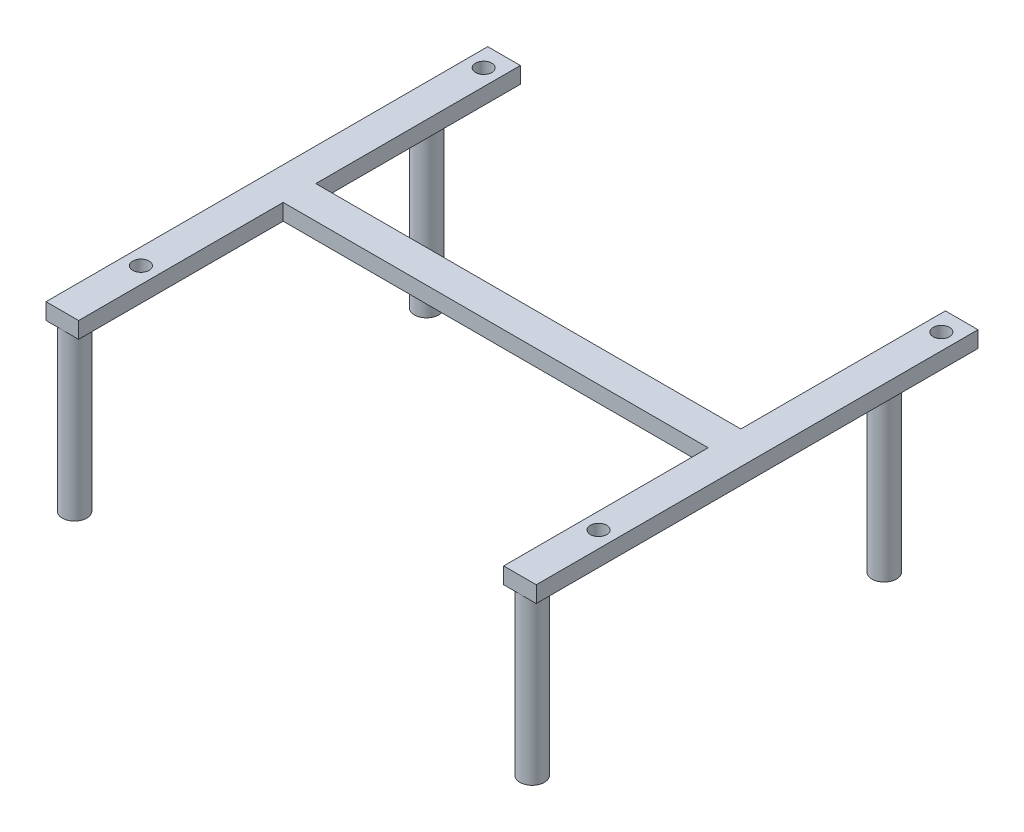
ISO-10303-21;
HEADER;
FILE_DESCRIPTION(('STEP AP214'),'2;1');
FILE_NAME('part.step','',(''),(''),'','','');
FILE_SCHEMA(('AUTOMOTIVE_DESIGN { 1 0 10303 214 1 1 1 1 }'));
ENDSEC;
DATA;
#1=APPLICATION_CONTEXT('core data for automotive mechanical design processes');
#2=APPLICATION_PROTOCOL_DEFINITION('international standard','automotive_design',2000,#1);
#3=PRODUCT_CONTEXT('',#1,'mechanical');
#4=PRODUCT('Part','Part','',(#3));
#5=PRODUCT_RELATED_PRODUCT_CATEGORY('part','',(#4));
#6=PRODUCT_DEFINITION_FORMATION('','',#4);
#7=PRODUCT_DEFINITION_CONTEXT('part definition',#1,'design');
#8=PRODUCT_DEFINITION('design','',#6,#7);
#9=PRODUCT_DEFINITION_SHAPE('','',#8);
#10=(LENGTH_UNIT() NAMED_UNIT(*) SI_UNIT(.MILLI.,.METRE.));
#11=(NAMED_UNIT(*) PLANE_ANGLE_UNIT() SI_UNIT($,.RADIAN.));
#12=(NAMED_UNIT(*) SI_UNIT($,.STERADIAN.) SOLID_ANGLE_UNIT());
#13=UNCERTAINTY_MEASURE_WITH_UNIT(LENGTH_MEASURE(1.E-05),#10,'distance_accuracy_value','');
#14=(GEOMETRIC_REPRESENTATION_CONTEXT(3) GLOBAL_UNCERTAINTY_ASSIGNED_CONTEXT((#13)) GLOBAL_UNIT_ASSIGNED_CONTEXT((#10,
#11,#12)) REPRESENTATION_CONTEXT('',''));
#15=CARTESIAN_POINT('',(0.,0.,0.));
#16=DIRECTION('',(0.,0.,1.));
#17=DIRECTION('',(1.,0.,0.));
#18=AXIS2_PLACEMENT_3D('',#15,#16,#17);
#19=CARTESIAN_POINT('',(56.13,20.,0.));
#20=DIRECTION('',(0.,-1.,0.));
#21=DIRECTION('',(0.,0.,-1.));
#22=AXIS2_PLACEMENT_3D('',#19,#20,#21);
#23=CYLINDRICAL_SURFACE('',#22,1.5);
#24=CARTESIAN_POINT('',(56.13,20.,0.));
#25=DIRECTION('',(0.,1.,0.));
#26=DIRECTION('',(0.,0.,1.));
#27=AXIS2_PLACEMENT_3D('',#24,#25,#26);
#28=CIRCLE('',#27,1.5);
#29=CARTESIAN_POINT('',(56.13,20.,1.49999999999999));
#30=VERTEX_POINT('',#29);
#31=EDGE_CURVE('E56',#30,#30,#28,.T.);
#32=ORIENTED_EDGE('',*,*,#31,.F.);
#33=EDGE_LOOP('',(#32));
#34=FACE_BOUND('',#33,.T.);
#35=CARTESIAN_POINT('',(56.13,0.,0.));
#36=DIRECTION('',(0.,1.,0.));
#37=DIRECTION('',(0.,0.,1.));
#38=AXIS2_PLACEMENT_3D('',#35,#36,#37);
#39=CIRCLE('',#38,1.5);
#40=CARTESIAN_POINT('',(56.13,0.,1.49999999999999));
#41=VERTEX_POINT('',#40);
#42=EDGE_CURVE('E11',#41,#41,#39,.T.);
#43=ORIENTED_EDGE('',*,*,#42,.T.);
#44=EDGE_LOOP('',(#43));
#45=FACE_BOUND('',#44,.T.);
#46=ADVANCED_FACE('F52',(#34,#45),#23,.T.);
#47=CARTESIAN_POINT('',(56.13,20.,0.));
#48=DIRECTION('',(0.,1.,0.));
#49=DIRECTION('',(0.,0.,1.));
#50=AXIS2_PLACEMENT_3D('',#47,#48,#49);
#51=PLANE('',#50);
#52=ORIENTED_EDGE('',*,*,#31,.T.);
#53=EDGE_LOOP('',(#52));
#54=FACE_BOUND('',#53,.T.);
#55=ADVANCED_FACE('F54',(#54),#51,.T.);
#56=CARTESIAN_POINT('',(56.13,0.,0.));
#57=DIRECTION('',(0.,1.,0.));
#58=DIRECTION('',(0.,0.,1.));
#59=AXIS2_PLACEMENT_3D('',#56,#57,#58);
#60=PLANE('',#59);
#61=ORIENTED_EDGE('',*,*,#42,.F.);
#62=EDGE_LOOP('',(#61));
#63=FACE_BOUND('',#62,.T.);
#64=ADVANCED_FACE('F71',(#63),#60,.F.);
#65=CLOSED_SHELL('',(#46,#55,#64));
#66=MANIFOLD_SOLID_BREP('B2',#65);
#67=CARTESIAN_POINT('',(56.13,20.,-43.18));
#68=DIRECTION('',(0.,-1.,0.));
#69=DIRECTION('',(0.,0.,-1.));
#70=AXIS2_PLACEMENT_3D('',#67,#68,#69);
#71=CYLINDRICAL_SURFACE('',#70,1.5);
#72=CARTESIAN_POINT('',(56.13,20.,-43.18));
#73=DIRECTION('',(0.,1.,0.));
#74=DIRECTION('',(0.,0.,1.));
#75=AXIS2_PLACEMENT_3D('',#72,#73,#74);
#76=CIRCLE('',#75,1.5);
#77=CARTESIAN_POINT('',(56.13,20.,-41.68));
#78=VERTEX_POINT('',#77);
#79=EDGE_CURVE('E106',#78,#78,#76,.T.);
#80=ORIENTED_EDGE('',*,*,#79,.F.);
#81=EDGE_LOOP('',(#80));
#82=FACE_BOUND('',#81,.T.);
#83=CARTESIAN_POINT('',(56.13,0.,-43.18));
#84=DIRECTION('',(0.,1.,0.));
#85=DIRECTION('',(0.,0.,1.));
#86=AXIS2_PLACEMENT_3D('',#83,#84,#85);
#87=CIRCLE('',#86,1.5);
#88=CARTESIAN_POINT('',(56.13,0.,-41.68));
#89=VERTEX_POINT('',#88);
#90=EDGE_CURVE('E51',#89,#89,#87,.T.);
#91=ORIENTED_EDGE('',*,*,#90,.T.);
#92=EDGE_LOOP('',(#91));
#93=FACE_BOUND('',#92,.T.);
#94=ADVANCED_FACE('F102',(#82,#93),#71,.T.);
#95=CARTESIAN_POINT('',(56.13,20.,-43.18));
#96=DIRECTION('',(0.,1.,0.));
#97=DIRECTION('',(0.,0.,1.));
#98=AXIS2_PLACEMENT_3D('',#95,#96,#97);
#99=PLANE('',#98);
#100=ORIENTED_EDGE('',*,*,#79,.T.);
#101=EDGE_LOOP('',(#100));
#102=FACE_BOUND('',#101,.T.);
#103=ADVANCED_FACE('F104',(#102),#99,.T.);
#104=CARTESIAN_POINT('',(56.13,0.,-43.18));
#105=DIRECTION('',(0.,1.,0.));
#106=DIRECTION('',(0.,0.,1.));
#107=AXIS2_PLACEMENT_3D('',#104,#105,#106);
#108=PLANE('',#107);
#109=ORIENTED_EDGE('',*,*,#90,.F.);
#110=EDGE_LOOP('',(#109));
#111=FACE_BOUND('',#110,.T.);
#112=ADVANCED_FACE('F121',(#111),#108,.F.);
#113=CLOSED_SHELL('',(#94,#103,#112));
#114=MANIFOLD_SOLID_BREP('B6',#113);
#115=CARTESIAN_POINT('',(0.,20.,0.));
#116=DIRECTION('',(0.,-1.,0.));
#117=DIRECTION('',(0.,0.,-1.));
#118=AXIS2_PLACEMENT_3D('',#115,#116,#117);
#119=CYLINDRICAL_SURFACE('',#118,1.5);
#120=CARTESIAN_POINT('',(0.,20.,0.));
#121=DIRECTION('',(0.,1.,0.));
#122=DIRECTION('',(0.,0.,1.));
#123=AXIS2_PLACEMENT_3D('',#120,#121,#122);
#124=CIRCLE('',#123,1.5);
#125=CARTESIAN_POINT('',(0.,20.,1.5));
#126=VERTEX_POINT('',#125);
#127=EDGE_CURVE('E151',#126,#126,#124,.T.);
#128=ORIENTED_EDGE('',*,*,#127,.F.);
#129=EDGE_LOOP('',(#128));
#130=FACE_BOUND('',#129,.T.);
#131=CARTESIAN_POINT('',(0.,0.,0.));
#132=DIRECTION('',(0.,1.,0.));
#133=DIRECTION('',(0.,0.,1.));
#134=AXIS2_PLACEMENT_3D('',#131,#132,#133);
#135=CIRCLE('',#134,1.5);
#136=CARTESIAN_POINT('',(0.,0.,1.5));
#137=VERTEX_POINT('',#136);
#138=EDGE_CURVE('E349',#137,#137,#135,.T.);
#139=ORIENTED_EDGE('',*,*,#138,.T.);
#140=EDGE_LOOP('',(#139));
#141=FACE_BOUND('',#140,.T.);
#142=ADVANCED_FACE('F143',(#130,#141),#119,.T.);
#143=CARTESIAN_POINT('',(0.,0.,0.));
#144=DIRECTION('',(0.,1.,0.));
#145=DIRECTION('',(0.,0.,1.));
#146=AXIS2_PLACEMENT_3D('',#143,#144,#145);
#147=PLANE('',#146);
#148=ORIENTED_EDGE('',*,*,#138,.F.);
#149=EDGE_LOOP('',(#148));
#150=FACE_BOUND('',#149,.T.);
#151=ADVANCED_FACE('F356',(#150),#147,.F.);
#152=CARTESIAN_POINT('',(0.,20.,0.));
#153=DIRECTION('',(0.,1.,0.));
#154=DIRECTION('',(0.,0.,1.));
#155=AXIS2_PLACEMENT_3D('',#152,#153,#154);
#156=PLANE('',#155);
#157=CARTESIAN_POINT('',(56.13,20.,-50.18));
#158=DIRECTION('',(0.,1.,0.));
#159=DIRECTION('',(0.,0.,1.));
#160=AXIS2_PLACEMENT_3D('',#157,#158,#159);
#161=CIRCLE('',#160,0.999999999999998);
#162=CARTESIAN_POINT('',(56.13,20.,-49.18));
#163=VERTEX_POINT('',#162);
#164=EDGE_CURVE('E459',#163,#163,#161,.F.);
#165=ORIENTED_EDGE('',*,*,#164,.F.);
#166=EDGE_LOOP('',(#165));
#167=FACE_BOUND('',#166,.T.);
#168=CARTESIAN_POINT('',(56.13,20.,-8.14300000000001));
#169=DIRECTION('',(0.,1.,0.));
#170=DIRECTION('',(0.,0.,1.));
#171=AXIS2_PLACEMENT_3D('',#168,#169,#170);
#172=CIRCLE('',#171,0.999999999999998);
#173=CARTESIAN_POINT('',(56.13,20.,-7.14300000000001));
#174=VERTEX_POINT('',#173);
#175=EDGE_CURVE('E452',#174,#174,#172,.F.);
#176=ORIENTED_EDGE('',*,*,#175,.F.);
#177=EDGE_LOOP('',(#176));
#178=FACE_BOUND('',#177,.T.);
#179=CARTESIAN_POINT('',(0.,20.,-8.143));
#180=DIRECTION('',(0.,1.,0.));
#181=DIRECTION('',(0.,0.,1.));
#182=AXIS2_PLACEMENT_3D('',#179,#180,#181);
#183=CIRCLE('',#182,1.);
#184=CARTESIAN_POINT('',(0.,20.,-7.143));
#185=VERTEX_POINT('',#184);
#186=EDGE_CURVE('E442',#185,#185,#183,.F.);
#187=ORIENTED_EDGE('',*,*,#186,.F.);
#188=EDGE_LOOP('',(#187));
#189=FACE_BOUND('',#188,.T.);
#190=CARTESIAN_POINT('',(0.,20.,-50.18));
#191=DIRECTION('',(0.,1.,0.));
#192=DIRECTION('',(0.,0.,1.));
#193=AXIS2_PLACEMENT_3D('',#190,#191,#192);
#194=CIRCLE('',#193,1.);
#195=CARTESIAN_POINT('',(0.,20.,-49.18));
#196=VERTEX_POINT('',#195);
#197=EDGE_CURVE('E469',#196,#196,#194,.F.);
#198=ORIENTED_EDGE('',*,*,#197,.F.);
#199=EDGE_LOOP('',(#198));
#200=FACE_BOUND('',#199,.T.);
#201=CARTESIAN_POINT('',(0.,20.,-43.18));
#202=DIRECTION('',(0.,1.,0.));
#203=DIRECTION('',(0.,0.,1.));
#204=AXIS2_PLACEMENT_3D('',#201,#202,#203);
#205=CIRCLE('',#204,1.5);
#206=CARTESIAN_POINT('',(0.,20.,-41.68));
#207=VERTEX_POINT('',#206);
#208=EDGE_CURVE('E100',#207,#207,#205,.F.);
#209=ORIENTED_EDGE('',*,*,#208,.F.);
#210=EDGE_LOOP('',(#209));
#211=FACE_BOUND('',#210,.T.);
#212=DIRECTION('',(1.,0.,0.));
#213=VECTOR('',#212,1.);
#214=CARTESIAN_POINT('',(-2.,20.,1.5));
#215=LINE('',#214,#213);
#216=CARTESIAN_POINT('',(2.,20.,1.5));
#217=VERTEX_POINT('',#216);
#218=EDGE_CURVE('E281',#126,#217,#215,.T.);
#219=ORIENTED_EDGE('',*,*,#218,.F.);
#220=ORIENTED_EDGE('',*,*,#127,.T.);
#221=CARTESIAN_POINT('',(-2.,20.,1.5));
#222=VERTEX_POINT('',#221);
#223=EDGE_CURVE('E282',#222,#126,#215,.T.);
#224=ORIENTED_EDGE('',*,*,#223,.F.);
#225=DIRECTION('',(0.,0.,1.));
#226=VECTOR('',#225,1.);
#227=CARTESIAN_POINT('',(-2.00000000000001,20.,-52.68));
#228=LINE('',#227,#226);
#229=CARTESIAN_POINT('',(-2.00000000000001,20.,-52.68));
#230=VERTEX_POINT('',#229);
#231=EDGE_CURVE('E277',#230,#222,#228,.T.);
#232=ORIENTED_EDGE('',*,*,#231,.F.);
#233=DIRECTION('',(-1.,0.,0.));
#234=VECTOR('',#233,1.);
#235=CARTESIAN_POINT('',(1.99999999999999,20.,-52.68));
#236=LINE('',#235,#234);
#237=CARTESIAN_POINT('',(1.99999999999999,20.,-52.68));
#238=VERTEX_POINT('',#237);
#239=EDGE_CURVE('E273',#238,#230,#236,.T.);
#240=ORIENTED_EDGE('',*,*,#239,.F.);
#241=DIRECTION('',(0.,0.,-1.));
#242=VECTOR('',#241,1.);
#243=CARTESIAN_POINT('',(1.99999999999999,20.,-52.68));
#244=LINE('',#243,#242);
#245=CARTESIAN_POINT('',(2.,20.,-27.59));
#246=VERTEX_POINT('',#245);
#247=EDGE_CURVE('E207',#246,#238,#244,.T.);
#248=ORIENTED_EDGE('',*,*,#247,.F.);
#249=DIRECTION('',(-1.,0.,0.));
#250=VECTOR('',#249,1.);
#251=CARTESIAN_POINT('',(2.,20.,-27.59));
#252=LINE('',#251,#250);
#253=CARTESIAN_POINT('',(54.13,20.,-27.59));
#254=VERTEX_POINT('',#253);
#255=EDGE_CURVE('E306',#254,#246,#252,.T.);
#256=ORIENTED_EDGE('',*,*,#255,.F.);
#257=DIRECTION('',(0.,0.,1.));
#258=VECTOR('',#257,1.);
#259=CARTESIAN_POINT('',(54.13,20.,-52.68));
#260=LINE('',#259,#258);
#261=CARTESIAN_POINT('',(54.13,20.,-52.68));
#262=VERTEX_POINT('',#261);
#263=EDGE_CURVE('E258',#262,#254,#260,.T.);
#264=ORIENTED_EDGE('',*,*,#263,.F.);
#265=DIRECTION('',(-1.,0.,0.));
#266=VECTOR('',#265,1.);
#267=CARTESIAN_POINT('',(58.13,20.,-52.68));
#268=LINE('',#267,#266);
#269=CARTESIAN_POINT('',(58.13,20.,-52.68));
#270=VERTEX_POINT('',#269);
#271=EDGE_CURVE('E301',#270,#262,#268,.T.);
#272=ORIENTED_EDGE('',*,*,#271,.F.);
#273=DIRECTION('',(0.,0.,-1.));
#274=VECTOR('',#273,1.);
#275=CARTESIAN_POINT('',(58.13,20.,1.49999999999999));
#276=LINE('',#275,#274);
#277=CARTESIAN_POINT('',(58.13,20.,1.49999999999999));
#278=VERTEX_POINT('',#277);
#279=EDGE_CURVE('E298',#278,#270,#276,.T.);
#280=ORIENTED_EDGE('',*,*,#279,.F.);
#281=DIRECTION('',(1.,0.,0.));
#282=VECTOR('',#281,1.);
#283=CARTESIAN_POINT('',(54.13,20.,1.49999999999999));
#284=LINE('',#283,#282);
#285=CARTESIAN_POINT('',(54.13,20.,1.49999999999999));
#286=VERTEX_POINT('',#285);
#287=EDGE_CURVE('E295',#286,#278,#284,.T.);
#288=ORIENTED_EDGE('',*,*,#287,.F.);
#289=DIRECTION('',(0.,0.,1.));
#290=VECTOR('',#289,1.);
#291=CARTESIAN_POINT('',(54.13,20.,-23.59));
#292=LINE('',#291,#290);
#293=CARTESIAN_POINT('',(54.13,20.,-23.59));
#294=VERTEX_POINT('',#293);
#295=EDGE_CURVE('E292',#294,#286,#292,.T.);
#296=ORIENTED_EDGE('',*,*,#295,.F.);
#297=DIRECTION('',(1.,0.,0.));
#298=VECTOR('',#297,1.);
#299=CARTESIAN_POINT('',(54.13,20.,-23.59));
#300=LINE('',#299,#298);
#301=CARTESIAN_POINT('',(2.,20.,-23.59));
#302=VERTEX_POINT('',#301);
#303=EDGE_CURVE('E289',#302,#294,#300,.T.);
#304=ORIENTED_EDGE('',*,*,#303,.F.);
#305=DIRECTION('',(0.,0.,-1.));
#306=VECTOR('',#305,1.);
#307=CARTESIAN_POINT('',(2.,20.,-23.59));
#308=LINE('',#307,#306);
#309=EDGE_CURVE('E286',#217,#302,#308,.T.);
#310=ORIENTED_EDGE('',*,*,#309,.F.);
#311=EDGE_LOOP('',(#219,#220,#224,#232,#240,#248,#256,#264,#272,#280,#288,#296,#304,#310));
#312=FACE_BOUND('',#311,.T.);
#313=ADVANCED_FACE('F358',(#167,#178,#189,#200,#211,#312),#156,.F.);
#314=CARTESIAN_POINT('',(1.99999999999999,22.,-52.68));
#315=DIRECTION('',(0.,0.,1.));
#316=DIRECTION('',(1.,0.,0.));
#317=AXIS2_PLACEMENT_3D('',#314,#315,#316);
#318=PLANE('',#317);
#319=ORIENTED_EDGE('',*,*,#239,.T.);
#320=DIRECTION('',(0.,-1.,0.));
#321=VECTOR('',#320,1.);
#322=CARTESIAN_POINT('',(-2.00000000000001,22.,-52.68));
#323=LINE('',#322,#321);
#324=CARTESIAN_POINT('',(-2.00000000000001,22.,-52.68));
#325=VERTEX_POINT('',#324);
#326=EDGE_CURVE('E346',#325,#230,#323,.T.);
#327=ORIENTED_EDGE('',*,*,#326,.F.);
#328=DIRECTION('',(-1.,0.,0.));
#329=VECTOR('',#328,1.);
#330=CARTESIAN_POINT('',(1.99999999999999,22.,-52.68));
#331=LINE('',#330,#329);
#332=CARTESIAN_POINT('',(1.99999999999999,22.,-52.68));
#333=VERTEX_POINT('',#332);
#334=EDGE_CURVE('E311',#333,#325,#331,.T.);
#335=ORIENTED_EDGE('',*,*,#334,.F.);
#336=DIRECTION('',(0.,-1.,0.));
#337=VECTOR('',#336,1.);
#338=CARTESIAN_POINT('',(1.99999999999999,22.,-52.68));
#339=LINE('',#338,#337);
#340=EDGE_CURVE('E269',#333,#238,#339,.T.);
#341=ORIENTED_EDGE('',*,*,#340,.T.);
#342=EDGE_LOOP('',(#319,#327,#335,#341));
#343=FACE_BOUND('',#342,.T.);
#344=ADVANCED_FACE('F363',(#343),#318,.F.);
#345=CARTESIAN_POINT('',(-2.00000000000001,22.,-52.68));
#346=DIRECTION('',(1.,0.,0.));
#347=DIRECTION('',(0.,0.,-1.));
#348=AXIS2_PLACEMENT_3D('',#345,#346,#347);
#349=PLANE('',#348);
#350=ORIENTED_EDGE('',*,*,#231,.T.);
#351=DIRECTION('',(0.,-1.,0.));
#352=VECTOR('',#351,1.);
#353=CARTESIAN_POINT('',(-2.,22.,1.5));
#354=LINE('',#353,#352);
#355=CARTESIAN_POINT('',(-2.,22.,1.5));
#356=VERTEX_POINT('',#355);
#357=EDGE_CURVE('E342',#356,#222,#354,.T.);
#358=ORIENTED_EDGE('',*,*,#357,.F.);
#359=DIRECTION('',(0.,0.,1.));
#360=VECTOR('',#359,1.);
#361=CARTESIAN_POINT('',(-2.00000000000001,22.,-52.68));
#362=LINE('',#361,#360);
#363=EDGE_CURVE('E216',#325,#356,#362,.T.);
#364=ORIENTED_EDGE('',*,*,#363,.F.);
#365=ORIENTED_EDGE('',*,*,#326,.T.);
#366=EDGE_LOOP('',(#350,#358,#364,#365));
#367=FACE_BOUND('',#366,.T.);
#368=ADVANCED_FACE('F369',(#367),#349,.F.);
#369=CARTESIAN_POINT('',(-2.,22.,1.5));
#370=DIRECTION('',(0.,0.,-1.));
#371=DIRECTION('',(-1.,0.,0.));
#372=AXIS2_PLACEMENT_3D('',#369,#370,#371);
#373=PLANE('',#372);
#374=ORIENTED_EDGE('',*,*,#223,.T.);
#375=ORIENTED_EDGE('',*,*,#218,.T.);
#376=DIRECTION('',(0.,-1.,0.));
#377=VECTOR('',#376,1.);
#378=CARTESIAN_POINT('',(2.,22.,1.5));
#379=LINE('',#378,#377);
#380=CARTESIAN_POINT('',(2.,22.,1.5));
#381=VERTEX_POINT('',#380);
#382=EDGE_CURVE('E338',#381,#217,#379,.T.);
#383=ORIENTED_EDGE('',*,*,#382,.F.);
#384=DIRECTION('',(1.,0.,0.));
#385=VECTOR('',#384,1.);
#386=CARTESIAN_POINT('',(-2.,22.,1.5));
#387=LINE('',#386,#385);
#388=EDGE_CURVE('E480',#356,#381,#387,.T.);
#389=ORIENTED_EDGE('',*,*,#388,.F.);
#390=ORIENTED_EDGE('',*,*,#357,.T.);
#391=EDGE_LOOP('',(#374,#375,#383,#389,#390));
#392=FACE_BOUND('',#391,.T.);
#393=ADVANCED_FACE('F373',(#392),#373,.F.);
#394=CARTESIAN_POINT('',(2.,22.,-23.59));
#395=DIRECTION('',(-1.,0.,0.));
#396=DIRECTION('',(0.,0.,1.));
#397=AXIS2_PLACEMENT_3D('',#394,#395,#396);
#398=PLANE('',#397);
#399=ORIENTED_EDGE('',*,*,#309,.T.);
#400=DIRECTION('',(0.,-1.,0.));
#401=VECTOR('',#400,1.);
#402=CARTESIAN_POINT('',(2.,22.,-23.59));
#403=LINE('',#402,#401);
#404=CARTESIAN_POINT('',(2.,22.,-23.59));
#405=VERTEX_POINT('',#404);
#406=EDGE_CURVE('E334',#405,#302,#403,.T.);
#407=ORIENTED_EDGE('',*,*,#406,.F.);
#408=DIRECTION('',(0.,0.,-1.));
#409=VECTOR('',#408,1.);
#410=CARTESIAN_POINT('',(2.,22.,-23.59));
#411=LINE('',#410,#409);
#412=EDGE_CURVE('E483',#381,#405,#411,.T.);
#413=ORIENTED_EDGE('',*,*,#412,.F.);
#414=ORIENTED_EDGE('',*,*,#382,.T.);
#415=EDGE_LOOP('',(#399,#407,#413,#414));
#416=FACE_BOUND('',#415,.T.);
#417=ADVANCED_FACE('F376',(#416),#398,.F.);
#418=CARTESIAN_POINT('',(54.13,22.,-23.59));
#419=DIRECTION('',(0.,0.,-1.));
#420=DIRECTION('',(-1.,0.,0.));
#421=AXIS2_PLACEMENT_3D('',#418,#419,#420);
#422=PLANE('',#421);
#423=ORIENTED_EDGE('',*,*,#303,.T.);
#424=DIRECTION('',(0.,-1.,0.));
#425=VECTOR('',#424,1.);
#426=CARTESIAN_POINT('',(54.13,22.,-23.59));
#427=LINE('',#426,#425);
#428=CARTESIAN_POINT('',(54.13,22.,-23.59));
#429=VERTEX_POINT('',#428);
#430=EDGE_CURVE('E330',#429,#294,#427,.T.);
#431=ORIENTED_EDGE('',*,*,#430,.F.);
#432=DIRECTION('',(1.,0.,0.));
#433=VECTOR('',#432,1.);
#434=CARTESIAN_POINT('',(54.13,22.,-23.59));
#435=LINE('',#434,#433);
#436=EDGE_CURVE('E486',#405,#429,#435,.T.);
#437=ORIENTED_EDGE('',*,*,#436,.F.);
#438=ORIENTED_EDGE('',*,*,#406,.T.);
#439=EDGE_LOOP('',(#423,#431,#437,#438));
#440=FACE_BOUND('',#439,.T.);
#441=ADVANCED_FACE('F380',(#440),#422,.F.);
#442=CARTESIAN_POINT('',(54.13,22.,-23.59));
#443=DIRECTION('',(1.,0.,0.));
#444=DIRECTION('',(0.,0.,-1.));
#445=AXIS2_PLACEMENT_3D('',#442,#443,#444);
#446=PLANE('',#445);
#447=ORIENTED_EDGE('',*,*,#295,.T.);
#448=DIRECTION('',(0.,-1.,0.));
#449=VECTOR('',#448,1.);
#450=CARTESIAN_POINT('',(54.13,22.,1.49999999999999));
#451=LINE('',#450,#449);
#452=CARTESIAN_POINT('',(54.13,22.,1.49999999999999));
#453=VERTEX_POINT('',#452);
#454=EDGE_CURVE('E326',#453,#286,#451,.T.);
#455=ORIENTED_EDGE('',*,*,#454,.F.);
#456=DIRECTION('',(0.,0.,1.));
#457=VECTOR('',#456,1.);
#458=CARTESIAN_POINT('',(54.13,22.,-23.59));
#459=LINE('',#458,#457);
#460=EDGE_CURVE('E489',#429,#453,#459,.T.);
#461=ORIENTED_EDGE('',*,*,#460,.F.);
#462=ORIENTED_EDGE('',*,*,#430,.T.);
#463=EDGE_LOOP('',(#447,#455,#461,#462));
#464=FACE_BOUND('',#463,.T.);
#465=ADVANCED_FACE('F384',(#464),#446,.F.);
#466=CARTESIAN_POINT('',(54.13,22.,1.49999999999999));
#467=DIRECTION('',(0.,0.,-1.));
#468=DIRECTION('',(-1.,0.,0.));
#469=AXIS2_PLACEMENT_3D('',#466,#467,#468);
#470=PLANE('',#469);
#471=ORIENTED_EDGE('',*,*,#287,.T.);
#472=DIRECTION('',(0.,-1.,0.));
#473=VECTOR('',#472,1.);
#474=CARTESIAN_POINT('',(58.13,22.,1.49999999999999));
#475=LINE('',#474,#473);
#476=CARTESIAN_POINT('',(58.13,22.,1.49999999999999));
#477=VERTEX_POINT('',#476);
#478=EDGE_CURVE('E322',#477,#278,#475,.T.);
#479=ORIENTED_EDGE('',*,*,#478,.F.);
#480=DIRECTION('',(1.,0.,0.));
#481=VECTOR('',#480,1.);
#482=CARTESIAN_POINT('',(54.13,22.,1.49999999999999));
#483=LINE('',#482,#481);
#484=EDGE_CURVE('E492',#453,#477,#483,.T.);
#485=ORIENTED_EDGE('',*,*,#484,.F.);
#486=ORIENTED_EDGE('',*,*,#454,.T.);
#487=EDGE_LOOP('',(#471,#479,#485,#486));
#488=FACE_BOUND('',#487,.T.);
#489=ADVANCED_FACE('F388',(#488),#470,.F.);
#490=CARTESIAN_POINT('',(58.13,22.,1.49999999999999));
#491=DIRECTION('',(-1.,0.,0.));
#492=DIRECTION('',(0.,0.,1.));
#493=AXIS2_PLACEMENT_3D('',#490,#491,#492);
#494=PLANE('',#493);
#495=ORIENTED_EDGE('',*,*,#279,.T.);
#496=DIRECTION('',(0.,-1.,0.));
#497=VECTOR('',#496,1.);
#498=CARTESIAN_POINT('',(58.13,22.,-52.68));
#499=LINE('',#498,#497);
#500=CARTESIAN_POINT('',(58.13,22.,-52.68));
#501=VERTEX_POINT('',#500);
#502=EDGE_CURVE('E318',#501,#270,#499,.T.);
#503=ORIENTED_EDGE('',*,*,#502,.F.);
#504=DIRECTION('',(0.,0.,-1.));
#505=VECTOR('',#504,1.);
#506=CARTESIAN_POINT('',(58.13,22.,1.49999999999999));
#507=LINE('',#506,#505);
#508=EDGE_CURVE('E495',#477,#501,#507,.T.);
#509=ORIENTED_EDGE('',*,*,#508,.F.);
#510=ORIENTED_EDGE('',*,*,#478,.T.);
#511=EDGE_LOOP('',(#495,#503,#509,#510));
#512=FACE_BOUND('',#511,.T.);
#513=ADVANCED_FACE('F392',(#512),#494,.F.);
#514=CARTESIAN_POINT('',(58.13,22.,-52.68));
#515=DIRECTION('',(0.,0.,1.));
#516=DIRECTION('',(1.,0.,0.));
#517=AXIS2_PLACEMENT_3D('',#514,#515,#516);
#518=PLANE('',#517);
#519=ORIENTED_EDGE('',*,*,#271,.T.);
#520=DIRECTION('',(0.,-1.,0.));
#521=VECTOR('',#520,1.);
#522=CARTESIAN_POINT('',(54.13,22.,-52.68));
#523=LINE('',#522,#521);
#524=CARTESIAN_POINT('',(54.13,22.,-52.68));
#525=VERTEX_POINT('',#524);
#526=EDGE_CURVE('E262',#525,#262,#523,.T.);
#527=ORIENTED_EDGE('',*,*,#526,.F.);
#528=DIRECTION('',(-1.,0.,0.));
#529=VECTOR('',#528,1.);
#530=CARTESIAN_POINT('',(58.13,22.,-52.68));
#531=LINE('',#530,#529);
#532=EDGE_CURVE('E248',#501,#525,#531,.T.);
#533=ORIENTED_EDGE('',*,*,#532,.F.);
#534=ORIENTED_EDGE('',*,*,#502,.T.);
#535=EDGE_LOOP('',(#519,#527,#533,#534));
#536=FACE_BOUND('',#535,.T.);
#537=ADVANCED_FACE('F396',(#536),#518,.F.);
#538=CARTESIAN_POINT('',(54.13,22.,-52.68));
#539=DIRECTION('',(1.,0.,0.));
#540=DIRECTION('',(0.,0.,-1.));
#541=AXIS2_PLACEMENT_3D('',#538,#539,#540);
#542=PLANE('',#541);
#543=ORIENTED_EDGE('',*,*,#263,.T.);
#544=DIRECTION('',(0.,-1.,0.));
#545=VECTOR('',#544,1.);
#546=CARTESIAN_POINT('',(54.13,22.,-27.59));
#547=LINE('',#546,#545);
#548=CARTESIAN_POINT('',(54.13,22.,-27.59));
#549=VERTEX_POINT('',#548);
#550=EDGE_CURVE('E255',#549,#254,#547,.T.);
#551=ORIENTED_EDGE('',*,*,#550,.F.);
#552=DIRECTION('',(0.,0.,1.));
#553=VECTOR('',#552,1.);
#554=CARTESIAN_POINT('',(54.13,22.,-52.68));
#555=LINE('',#554,#553);
#556=EDGE_CURVE('E241',#525,#549,#555,.T.);
#557=ORIENTED_EDGE('',*,*,#556,.F.);
#558=ORIENTED_EDGE('',*,*,#526,.T.);
#559=EDGE_LOOP('',(#543,#551,#557,#558));
#560=FACE_BOUND('',#559,.T.);
#561=ADVANCED_FACE('F256',(#560),#542,.F.);
#562=CARTESIAN_POINT('',(2.,22.,-27.59));
#563=DIRECTION('',(0.,0.,1.));
#564=DIRECTION('',(1.,0.,0.));
#565=AXIS2_PLACEMENT_3D('',#562,#563,#564);
#566=PLANE('',#565);
#567=ORIENTED_EDGE('',*,*,#255,.T.);
#568=DIRECTION('',(0.,-1.,0.));
#569=VECTOR('',#568,1.);
#570=CARTESIAN_POINT('',(2.,22.,-27.59));
#571=LINE('',#570,#569);
#572=CARTESIAN_POINT('',(2.,22.,-27.59));
#573=VERTEX_POINT('',#572);
#574=EDGE_CURVE('E263',#573,#246,#571,.T.);
#575=ORIENTED_EDGE('',*,*,#574,.F.);
#576=DIRECTION('',(-1.,0.,0.));
#577=VECTOR('',#576,1.);
#578=CARTESIAN_POINT('',(2.,22.,-27.59));
#579=LINE('',#578,#577);
#580=EDGE_CURVE('E245',#549,#573,#579,.T.);
#581=ORIENTED_EDGE('',*,*,#580,.F.);
#582=ORIENTED_EDGE('',*,*,#550,.T.);
#583=EDGE_LOOP('',(#567,#575,#581,#582));
#584=FACE_BOUND('',#583,.T.);
#585=ADVANCED_FACE('F265',(#584),#566,.F.);
#586=CARTESIAN_POINT('',(1.99999999999999,22.,-52.68));
#587=DIRECTION('',(-1.,0.,0.));
#588=DIRECTION('',(0.,0.,1.));
#589=AXIS2_PLACEMENT_3D('',#586,#587,#588);
#590=PLANE('',#589);
#591=ORIENTED_EDGE('',*,*,#247,.T.);
#592=ORIENTED_EDGE('',*,*,#340,.F.);
#593=DIRECTION('',(0.,0.,-1.));
#594=VECTOR('',#593,1.);
#595=CARTESIAN_POINT('',(1.99999999999999,22.,-52.68));
#596=LINE('',#595,#594);
#597=EDGE_CURVE('E163',#573,#333,#596,.T.);
#598=ORIENTED_EDGE('',*,*,#597,.F.);
#599=ORIENTED_EDGE('',*,*,#574,.T.);
#600=EDGE_LOOP('',(#591,#592,#598,#599));
#601=FACE_BOUND('',#600,.T.);
#602=ADVANCED_FACE('F405',(#601),#590,.F.);
#603=CARTESIAN_POINT('',(0.,22.,0.));
#604=DIRECTION('',(0.,1.,0.));
#605=DIRECTION('',(0.,0.,1.));
#606=AXIS2_PLACEMENT_3D('',#603,#604,#605);
#607=PLANE('',#606);
#608=CARTESIAN_POINT('',(56.13,22.,-50.18));
#609=DIRECTION('',(0.,1.,0.));
#610=DIRECTION('',(0.,0.,-1.));
#611=AXIS2_PLACEMENT_3D('',#608,#609,#610);
#612=CIRCLE('',#611,0.999999999999998);
#613=CARTESIAN_POINT('',(56.13,22.,-51.18));
#614=VERTEX_POINT('',#613);
#615=EDGE_CURVE('E457',#614,#614,#612,.T.);
#616=ORIENTED_EDGE('',*,*,#615,.F.);
#617=EDGE_LOOP('',(#616));
#618=FACE_BOUND('',#617,.T.);
#619=CARTESIAN_POINT('',(56.13,22.,-8.14300000000001));
#620=DIRECTION('',(0.,1.,0.));
#621=DIRECTION('',(0.,0.,-1.));
#622=AXIS2_PLACEMENT_3D('',#619,#620,#621);
#623=CIRCLE('',#622,0.999999999999998);
#624=CARTESIAN_POINT('',(56.13,22.,-9.14300000000001));
#625=VERTEX_POINT('',#624);
#626=EDGE_CURVE('E445',#625,#625,#623,.T.);
#627=ORIENTED_EDGE('',*,*,#626,.F.);
#628=EDGE_LOOP('',(#627));
#629=FACE_BOUND('',#628,.T.);
#630=CARTESIAN_POINT('',(0.,22.,-8.143));
#631=DIRECTION('',(0.,1.,0.));
#632=DIRECTION('',(0.,0.,1.));
#633=AXIS2_PLACEMENT_3D('',#630,#631,#632);
#634=CIRCLE('',#633,1.);
#635=CARTESIAN_POINT('',(0.,22.,-7.143));
#636=VERTEX_POINT('',#635);
#637=EDGE_CURVE('E439',#636,#636,#634,.T.);
#638=ORIENTED_EDGE('',*,*,#637,.F.);
#639=EDGE_LOOP('',(#638));
#640=FACE_BOUND('',#639,.T.);
#641=CARTESIAN_POINT('',(0.,22.,-50.18));
#642=DIRECTION('',(0.,1.,0.));
#643=DIRECTION('',(0.,0.,1.));
#644=AXIS2_PLACEMENT_3D('',#641,#642,#643);
#645=CIRCLE('',#644,1.);
#646=CARTESIAN_POINT('',(0.,22.,-49.18));
#647=VERTEX_POINT('',#646);
#648=EDGE_CURVE('E449',#647,#647,#645,.T.);
#649=ORIENTED_EDGE('',*,*,#648,.F.);
#650=EDGE_LOOP('',(#649));
#651=FACE_BOUND('',#650,.T.);
#652=ORIENTED_EDGE('',*,*,#334,.T.);
#653=ORIENTED_EDGE('',*,*,#363,.T.);
#654=ORIENTED_EDGE('',*,*,#388,.T.);
#655=ORIENTED_EDGE('',*,*,#412,.T.);
#656=ORIENTED_EDGE('',*,*,#436,.T.);
#657=ORIENTED_EDGE('',*,*,#460,.T.);
#658=ORIENTED_EDGE('',*,*,#484,.T.);
#659=ORIENTED_EDGE('',*,*,#508,.T.);
#660=ORIENTED_EDGE('',*,*,#532,.T.);
#661=ORIENTED_EDGE('',*,*,#556,.T.);
#662=ORIENTED_EDGE('',*,*,#580,.T.);
#663=ORIENTED_EDGE('',*,*,#597,.T.);
#664=EDGE_LOOP('',(#652,#653,#654,#655,#656,#657,#658,#659,#660,#661,#662,#663));
#665=FACE_BOUND('',#664,.T.);
#666=ADVANCED_FACE('F243',(#618,#629,#640,#651,#665),#607,.T.);
#667=CARTESIAN_POINT('',(0.,20.,-43.18));
#668=DIRECTION('',(0.,-1.,0.));
#669=DIRECTION('',(0.,0.,-1.));
#670=AXIS2_PLACEMENT_3D('',#667,#668,#669);
#671=CYLINDRICAL_SURFACE('',#670,1.5);
#672=ORIENTED_EDGE('',*,*,#208,.T.);
#673=EDGE_LOOP('',(#672));
#674=FACE_BOUND('',#673,.T.);
#675=CARTESIAN_POINT('',(0.,0.,-43.18));
#676=DIRECTION('',(0.,1.,0.));
#677=DIRECTION('',(0.,0.,1.));
#678=AXIS2_PLACEMENT_3D('',#675,#676,#677);
#679=CIRCLE('',#678,1.5);
#680=CARTESIAN_POINT('',(0.,0.,-41.68));
#681=VERTEX_POINT('',#680);
#682=EDGE_CURVE('E278',#681,#681,#679,.T.);
#683=ORIENTED_EDGE('',*,*,#682,.T.);
#684=EDGE_LOOP('',(#683));
#685=FACE_BOUND('',#684,.T.);
#686=ADVANCED_FACE('F410',(#674,#685),#671,.T.);
#687=CARTESIAN_POINT('',(0.,0.,-43.18));
#688=DIRECTION('',(0.,1.,0.));
#689=DIRECTION('',(0.,0.,1.));
#690=AXIS2_PLACEMENT_3D('',#687,#688,#689);
#691=PLANE('',#690);
#692=ORIENTED_EDGE('',*,*,#682,.F.);
#693=EDGE_LOOP('',(#692));
#694=FACE_BOUND('',#693,.T.);
#695=ADVANCED_FACE('F412',(#694),#691,.F.);
#696=CARTESIAN_POINT('',(0.,-0.001000000000001,-50.18));
#697=DIRECTION('',(0.,1.,0.));
#698=DIRECTION('',(0.,0.,1.));
#699=AXIS2_PLACEMENT_3D('',#696,#697,#698);
#700=CYLINDRICAL_SURFACE('',#699,1.);
#701=ORIENTED_EDGE('',*,*,#648,.T.);
#702=EDGE_LOOP('',(#701));
#703=FACE_BOUND('',#702,.T.);
#704=ORIENTED_EDGE('',*,*,#197,.T.);
#705=EDGE_LOOP('',(#704));
#706=FACE_BOUND('',#705,.T.);
#707=ADVANCED_FACE('F415',(#703,#706),#700,.F.);
#708=CARTESIAN_POINT('',(0.,-0.001000000000001,-8.143));
#709=DIRECTION('',(0.,1.,0.));
#710=DIRECTION('',(0.,0.,1.));
#711=AXIS2_PLACEMENT_3D('',#708,#709,#710);
#712=CYLINDRICAL_SURFACE('',#711,1.);
#713=ORIENTED_EDGE('',*,*,#637,.T.);
#714=EDGE_LOOP('',(#713));
#715=FACE_BOUND('',#714,.T.);
#716=ORIENTED_EDGE('',*,*,#186,.T.);
#717=EDGE_LOOP('',(#716));
#718=FACE_BOUND('',#717,.T.);
#719=ADVANCED_FACE('F422',(#715,#718),#712,.F.);
#720=CARTESIAN_POINT('',(56.13,-0.001000000000001,-8.14300000000001));
#721=DIRECTION('',(0.,1.,0.));
#722=DIRECTION('',(0.,0.,1.));
#723=AXIS2_PLACEMENT_3D('',#720,#721,#722);
#724=CYLINDRICAL_SURFACE('',#723,0.999999999999998);
#725=ORIENTED_EDGE('',*,*,#626,.T.);
#726=EDGE_LOOP('',(#725));
#727=FACE_BOUND('',#726,.T.);
#728=ORIENTED_EDGE('',*,*,#175,.T.);
#729=EDGE_LOOP('',(#728));
#730=FACE_BOUND('',#729,.T.);
#731=ADVANCED_FACE('F427',(#727,#730),#724,.F.);
#732=CARTESIAN_POINT('',(56.13,-0.001000000000001,-50.18));
#733=DIRECTION('',(0.,1.,0.));
#734=DIRECTION('',(0.,0.,1.));
#735=AXIS2_PLACEMENT_3D('',#732,#733,#734);
#736=CYLINDRICAL_SURFACE('',#735,0.999999999999998);
#737=ORIENTED_EDGE('',*,*,#615,.T.);
#738=EDGE_LOOP('',(#737));
#739=FACE_BOUND('',#738,.T.);
#740=ORIENTED_EDGE('',*,*,#164,.T.);
#741=EDGE_LOOP('',(#740));
#742=FACE_BOUND('',#741,.T.);
#743=ADVANCED_FACE('F424',(#739,#742),#736,.F.);
#744=CLOSED_SHELL('',(#142,#151,#313,#344,#368,#393,#417,#441,#465,#489,#513,#537,#561,#585,
#602,#666,#686,#695,#707,#719,#731,#743));
#745=MANIFOLD_SOLID_BREP('B46',#744);
#746=ADVANCED_BREP_SHAPE_REPRESENTATION('',(#18,#66,#114,#745),#14);
#747=SHAPE_DEFINITION_REPRESENTATION(#9,#746);
ENDSEC;
END-ISO-10303-21;
